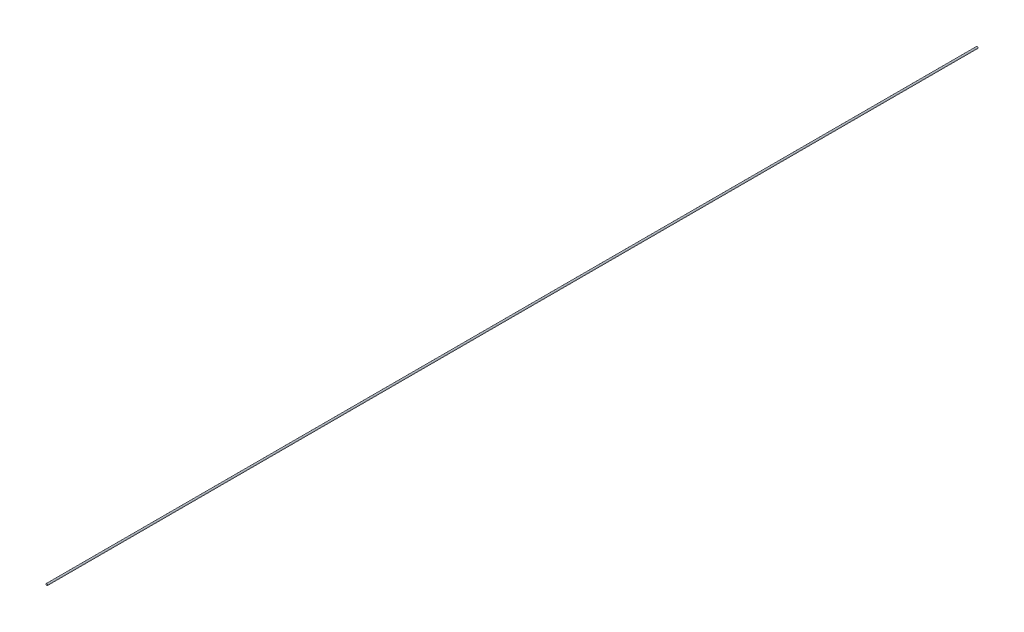
ISO-10303-21;
HEADER;
FILE_DESCRIPTION(('STEP AP214'),'2;1');
FILE_NAME('part.step','',(''),(''),'','','');
FILE_SCHEMA(('AUTOMOTIVE_DESIGN { 1 0 10303 214 1 1 1 1 }'));
ENDSEC;
DATA;
#1=APPLICATION_CONTEXT('core data for automotive mechanical design processes');
#2=APPLICATION_PROTOCOL_DEFINITION('international standard','automotive_design',2000,#1);
#3=PRODUCT_CONTEXT('',#1,'mechanical');
#4=PRODUCT('Part','Part','',(#3));
#5=PRODUCT_RELATED_PRODUCT_CATEGORY('part','',(#4));
#6=PRODUCT_DEFINITION_FORMATION('','',#4);
#7=PRODUCT_DEFINITION_CONTEXT('part definition',#1,'design');
#8=PRODUCT_DEFINITION('design','',#6,#7);
#9=PRODUCT_DEFINITION_SHAPE('','',#8);
#10=(LENGTH_UNIT() NAMED_UNIT(*) SI_UNIT(.MILLI.,.METRE.));
#11=(NAMED_UNIT(*) PLANE_ANGLE_UNIT() SI_UNIT($,.RADIAN.));
#12=(NAMED_UNIT(*) SI_UNIT($,.STERADIAN.) SOLID_ANGLE_UNIT());
#13=UNCERTAINTY_MEASURE_WITH_UNIT(LENGTH_MEASURE(1.E-05),#10,'distance_accuracy_value','');
#14=(GEOMETRIC_REPRESENTATION_CONTEXT(3) GLOBAL_UNCERTAINTY_ASSIGNED_CONTEXT((#13)) GLOBAL_UNIT_ASSIGNED_CONTEXT((#10,
#11,#12)) REPRESENTATION_CONTEXT('',''));
#15=CARTESIAN_POINT('',(0.,0.,0.));
#16=DIRECTION('',(0.,0.,1.));
#17=DIRECTION('',(1.,0.,0.));
#18=AXIS2_PLACEMENT_3D('',#15,#16,#17);
#19=CARTESIAN_POINT('',(0.,0.,1650.));
#20=DIRECTION('',(0.,0.,-1.));
#21=DIRECTION('',(-1.,0.,0.));
#22=AXIS2_PLACEMENT_3D('',#19,#20,#21);
#23=CYLINDRICAL_SURFACE('',#22,3.);
#24=CARTESIAN_POINT('',(0.,0.,1650.));
#25=DIRECTION('',(0.,0.,1.));
#26=DIRECTION('',(1.,0.,0.));
#27=AXIS2_PLACEMENT_3D('',#24,#25,#26);
#28=CIRCLE('',#27,3.);
#29=CARTESIAN_POINT('',(-3.,0.,1650.));
#30=VERTEX_POINT('',#29);
#31=EDGE_CURVE('E10',#30,#30,#28,.T.);
#32=CARTESIAN_POINT('',(0.,0.,-1650.));
#33=DIRECTION('',(0.,0.,1.));
#34=DIRECTION('',(1.,0.,0.));
#35=AXIS2_PLACEMENT_3D('',#32,#33,#34);
#36=CIRCLE('',#35,3.);
#37=CARTESIAN_POINT('',(-3.,0.,-1650.));
#38=VERTEX_POINT('',#37);
#39=EDGE_CURVE('E34',#38,#38,#36,.T.);
#40=CARTESIAN_POINT('',(-3.,0.,1650.));
#41=CARTESIAN_POINT('',(-3.,0.,1615.625));
#42=CARTESIAN_POINT('',(-3.,0.,1581.25));
#43=CARTESIAN_POINT('',(-3.,0.,1512.5));
#44=CARTESIAN_POINT('',(-3.,0.,1478.125));
#45=CARTESIAN_POINT('',(-3.,0.,1409.375));
#46=CARTESIAN_POINT('',(-3.,0.,1375.));
#47=CARTESIAN_POINT('',(-3.,0.,1306.25));
#48=CARTESIAN_POINT('',(-3.,0.,1271.875));
#49=CARTESIAN_POINT('',(-3.,0.,1203.125));
#50=CARTESIAN_POINT('',(-3.,0.,1168.75));
#51=CARTESIAN_POINT('',(-3.,0.,1100.));
#52=CARTESIAN_POINT('',(-3.,0.,1065.625));
#53=CARTESIAN_POINT('',(-3.,0.,996.875));
#54=CARTESIAN_POINT('',(-3.,0.,962.5));
#55=CARTESIAN_POINT('',(-3.,0.,893.75));
#56=CARTESIAN_POINT('',(-3.,0.,859.375));
#57=CARTESIAN_POINT('',(-3.,0.,790.625));
#58=CARTESIAN_POINT('',(-3.,0.,756.25));
#59=CARTESIAN_POINT('',(-3.,0.,687.5));
#60=CARTESIAN_POINT('',(-3.,0.,653.125));
#61=CARTESIAN_POINT('',(-3.,0.,584.375));
#62=CARTESIAN_POINT('',(-3.,0.,550.));
#63=CARTESIAN_POINT('',(-3.,0.,481.25));
#64=CARTESIAN_POINT('',(-3.,0.,446.875));
#65=CARTESIAN_POINT('',(-3.,0.,378.125));
#66=CARTESIAN_POINT('',(-3.,0.,343.75));
#67=CARTESIAN_POINT('',(-3.,0.,275.));
#68=CARTESIAN_POINT('',(-3.,0.,240.625));
#69=CARTESIAN_POINT('',(-3.,0.,171.875));
#70=CARTESIAN_POINT('',(-3.,0.,137.5));
#71=CARTESIAN_POINT('',(-3.,0.,68.7499999999999));
#72=CARTESIAN_POINT('',(-3.,0.,34.375));
#73=CARTESIAN_POINT('',(-3.,0.,-34.375));
#74=CARTESIAN_POINT('',(-3.,0.,-68.7499999999999));
#75=CARTESIAN_POINT('',(-3.,0.,-137.5));
#76=CARTESIAN_POINT('',(-3.,0.,-171.875));
#77=CARTESIAN_POINT('',(-3.,0.,-240.625));
#78=CARTESIAN_POINT('',(-3.,0.,-275.));
#79=CARTESIAN_POINT('',(-3.,0.,-343.75));
#80=CARTESIAN_POINT('',(-3.,0.,-378.125));
#81=CARTESIAN_POINT('',(-3.,0.,-446.875));
#82=CARTESIAN_POINT('',(-3.,0.,-481.25));
#83=CARTESIAN_POINT('',(-3.,0.,-550.));
#84=CARTESIAN_POINT('',(-3.,0.,-584.375));
#85=CARTESIAN_POINT('',(-3.,0.,-653.125));
#86=CARTESIAN_POINT('',(-3.,0.,-687.5));
#87=CARTESIAN_POINT('',(-3.,0.,-756.25));
#88=CARTESIAN_POINT('',(-3.,0.,-790.625));
#89=CARTESIAN_POINT('',(-3.,0.,-859.375));
#90=CARTESIAN_POINT('',(-3.,0.,-893.75));
#91=CARTESIAN_POINT('',(-3.,0.,-962.5));
#92=CARTESIAN_POINT('',(-3.,0.,-996.875));
#93=CARTESIAN_POINT('',(-3.,0.,-1065.625));
#94=CARTESIAN_POINT('',(-3.,0.,-1100.));
#95=CARTESIAN_POINT('',(-3.,0.,-1168.75));
#96=CARTESIAN_POINT('',(-3.,0.,-1203.125));
#97=CARTESIAN_POINT('',(-3.,0.,-1271.875));
#98=CARTESIAN_POINT('',(-3.,0.,-1306.25));
#99=CARTESIAN_POINT('',(-3.,0.,-1375.));
#100=CARTESIAN_POINT('',(-3.,0.,-1409.375));
#101=CARTESIAN_POINT('',(-3.,0.,-1478.125));
#102=CARTESIAN_POINT('',(-3.,0.,-1512.5));
#103=CARTESIAN_POINT('',(-3.,0.,-1581.25));
#104=CARTESIAN_POINT('',(-3.,0.,-1615.625));
#105=CARTESIAN_POINT('',(-3.,0.,-1650.));
#106=B_SPLINE_CURVE_WITH_KNOTS('',3,(#40,#41,#42,#43,#44,#45,#46,#47,#48,#49,#50,#51,#52,#53,
#54,#55,#56,#57,#58,#59,#60,#61,#62,#63,#64,#65,#66,#67,#68,#69,#70,#71,#72,#73,#74,#75,#76,#77,
#78,#79,#80,#81,#82,#83,#84,#85,#86,#87,#88,#89,#90,#91,#92,#93,#94,#95,#96,#97,#98,#99,#100,
#101,#102,#103,#104,#105),.UNSPECIFIED.,.F.,.F.,(4,2,2,2,2,2,2,2,2,2,2,2,2,2,2,2,2,2,2,2,2,2,2,
2,2,2,2,2,2,2,2,2,4),(0.,103.125,206.25,309.375,412.5,515.625,618.75,721.875,825.,928.125,
1031.25,1134.375,1237.5,1340.625,1443.75,1546.875,1650.,1753.125,1856.25,1959.375,2062.5,
2165.625,2268.75,2371.875,2475.,2578.125,2681.25,2784.375,2887.5,2990.625,3093.75,3196.875,
3300.),.UNSPECIFIED.);
#107=EDGE_CURVE('BSEAM31',#30,#38,#106,.T.);
#108=ORIENTED_EDGE('',*,*,#31,.F.);
#109=ORIENTED_EDGE('',*,*,#39,.T.);
#110=ORIENTED_EDGE('',*,*,#107,.T.);
#111=ORIENTED_EDGE('',*,*,#107,.F.);
#112=EDGE_LOOP('',(#108,#110,#109,#111));
#113=FACE_BOUND('',#112,.T.);
#114=ADVANCED_FACE('F31',(#113),#23,.T.);
#115=CARTESIAN_POINT('',(0.,0.,1650.));
#116=DIRECTION('',(0.,0.,1.));
#117=DIRECTION('',(1.,0.,0.));
#118=AXIS2_PLACEMENT_3D('',#115,#116,#117);
#119=PLANE('',#118);
#120=ORIENTED_EDGE('',*,*,#31,.T.);
#121=EDGE_LOOP('',(#120));
#122=FACE_BOUND('',#121,.T.);
#123=ADVANCED_FACE('F46',(#122),#119,.T.);
#124=CARTESIAN_POINT('',(0.,0.,-1650.));
#125=DIRECTION('',(0.,0.,1.));
#126=DIRECTION('',(1.,0.,0.));
#127=AXIS2_PLACEMENT_3D('',#124,#125,#126);
#128=PLANE('',#127);
#129=ORIENTED_EDGE('',*,*,#39,.F.);
#130=EDGE_LOOP('',(#129));
#131=FACE_BOUND('',#130,.T.);
#132=ADVANCED_FACE('F44',(#131),#128,.F.);
#133=CLOSED_SHELL('',(#114,#123,#132));
#134=MANIFOLD_SOLID_BREP('B2',#133);
#135=ADVANCED_BREP_SHAPE_REPRESENTATION('',(#18,#134),#14);
#136=SHAPE_DEFINITION_REPRESENTATION(#9,#135);
ENDSEC;
END-ISO-10303-21;
